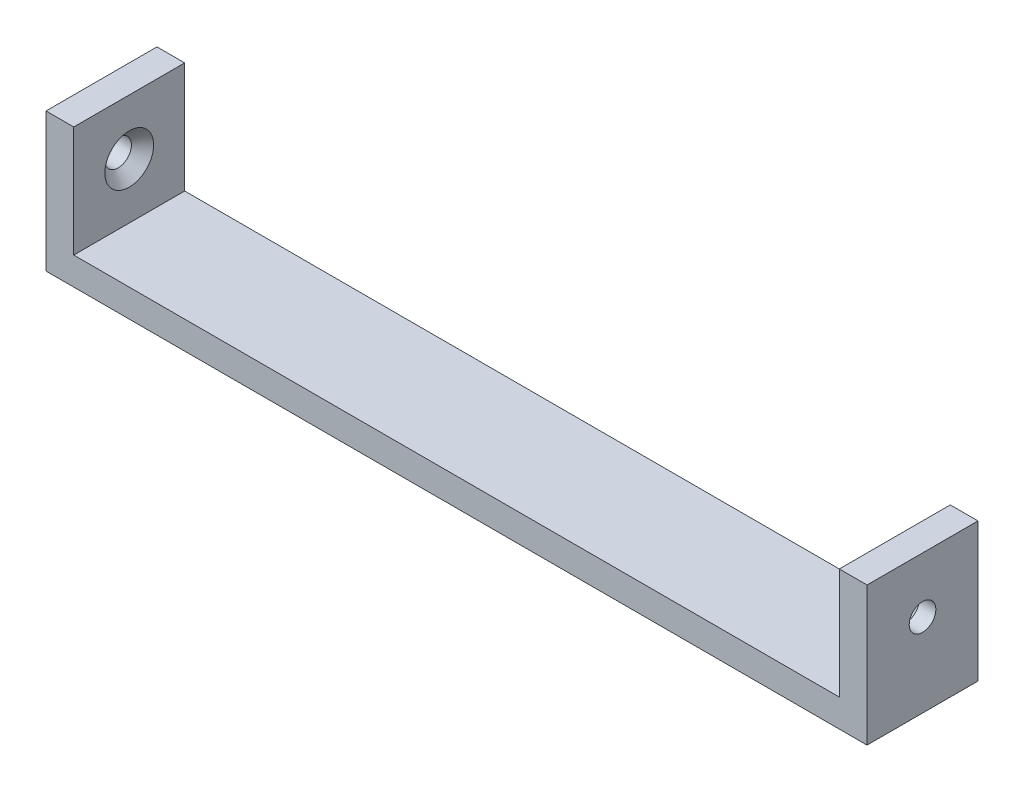
ISO-10303-21;
HEADER;
FILE_DESCRIPTION(('STEP AP214'),'2;1');
FILE_NAME('part.step','',(''),(''),'','','');
FILE_SCHEMA(('AUTOMOTIVE_DESIGN { 1 0 10303 214 1 1 1 1 }'));
ENDSEC;
DATA;
#1=APPLICATION_CONTEXT('core data for automotive mechanical design processes');
#2=APPLICATION_PROTOCOL_DEFINITION('international standard','automotive_design',2000,#1);
#3=PRODUCT_CONTEXT('',#1,'mechanical');
#4=PRODUCT('Part','Part','',(#3));
#5=PRODUCT_RELATED_PRODUCT_CATEGORY('part','',(#4));
#6=PRODUCT_DEFINITION_FORMATION('','',#4);
#7=PRODUCT_DEFINITION_CONTEXT('part definition',#1,'design');
#8=PRODUCT_DEFINITION('design','',#6,#7);
#9=PRODUCT_DEFINITION_SHAPE('','',#8);
#10=(LENGTH_UNIT() NAMED_UNIT(*) SI_UNIT(.MILLI.,.METRE.));
#11=(NAMED_UNIT(*) PLANE_ANGLE_UNIT() SI_UNIT($,.RADIAN.));
#12=(NAMED_UNIT(*) SI_UNIT($,.STERADIAN.) SOLID_ANGLE_UNIT());
#13=UNCERTAINTY_MEASURE_WITH_UNIT(LENGTH_MEASURE(1.E-05),#10,'distance_accuracy_value','');
#14=(GEOMETRIC_REPRESENTATION_CONTEXT(3) GLOBAL_UNCERTAINTY_ASSIGNED_CONTEXT((#13)) GLOBAL_UNIT_ASSIGNED_CONTEXT((#10,
#11,#12)) REPRESENTATION_CONTEXT('',''));
#15=CARTESIAN_POINT('',(0.,0.,0.));
#16=DIRECTION('',(0.,0.,1.));
#17=DIRECTION('',(1.,0.,0.));
#18=AXIS2_PLACEMENT_3D('',#15,#16,#17);
#19=CARTESIAN_POINT('',(0.,2.5,0.));
#20=DIRECTION('',(0.,1.,0.));
#21=DIRECTION('',(0.,0.,1.));
#22=AXIS2_PLACEMENT_3D('',#19,#20,#21);
#23=PLANE('',#22);
#24=DIRECTION('',(1.,0.,0.));
#25=VECTOR('',#24,1.);
#26=CARTESIAN_POINT('',(-11.6417360762424,2.5,4.3080112618134));
#27=LINE('',#26,#25);
#28=CARTESIAN_POINT('',(-9.14173607624238,2.5,4.3080112618134));
#29=VERTEX_POINT('',#28);
#30=CARTESIAN_POINT('',(59.8582639237576,2.5,4.3080112618134));
#31=VERTEX_POINT('',#30);
#32=EDGE_CURVE('E53',#29,#31,#27,.T.);
#33=ORIENTED_EDGE('',*,*,#32,.T.);
#34=DIRECTION('',(0.,0.,1.));
#35=VECTOR('',#34,1.);
#36=CARTESIAN_POINT('',(59.8582639237576,2.5,-5.6919887381866));
#37=LINE('',#36,#35);
#38=CARTESIAN_POINT('',(59.8582639237576,2.5,-5.6919887381866));
#39=VERTEX_POINT('',#38);
#40=EDGE_CURVE('E48',#39,#31,#37,.T.);
#41=ORIENTED_EDGE('',*,*,#40,.F.);
#42=DIRECTION('',(1.,0.,0.));
#43=VECTOR('',#42,1.);
#44=CARTESIAN_POINT('',(-11.6417360762424,2.5,-5.6919887381866));
#45=LINE('',#44,#43);
#46=CARTESIAN_POINT('',(-9.14173607624238,2.5,-5.6919887381866));
#47=VERTEX_POINT('',#46);
#48=EDGE_CURVE('E154',#47,#39,#45,.T.);
#49=ORIENTED_EDGE('',*,*,#48,.F.);
#50=DIRECTION('',(0.,0.,-1.));
#51=VECTOR('',#50,1.);
#52=CARTESIAN_POINT('',(-9.14173607624238,2.5,-5.6919887381866));
#53=LINE('',#52,#51);
#54=EDGE_CURVE('E133',#29,#47,#53,.T.);
#55=ORIENTED_EDGE('',*,*,#54,.F.);
#56=EDGE_LOOP('',(#33,#41,#49,#55));
#57=FACE_BOUND('',#56,.T.);
#58=ADVANCED_FACE('F33',(#57),#23,.T.);
#59=CARTESIAN_POINT('',(-11.6417360762424,2.5,-5.6919887381866));
#60=DIRECTION('',(1.,0.,0.));
#61=DIRECTION('',(0.,0.,-1.));
#62=AXIS2_PLACEMENT_3D('',#59,#60,#61);
#63=PLANE('',#62);
#64=CARTESIAN_POINT('',(-11.6417360762424,7.5,-0.6919887381866));
#65=DIRECTION('',(1.,0.,0.));
#66=DIRECTION('',(0.,0.,-1.));
#67=AXIS2_PLACEMENT_3D('',#64,#65,#66);
#68=CIRCLE('',#67,1.19999999999999);
#69=CARTESIAN_POINT('',(-11.6417360762424,7.5,-1.89198873818659));
#70=VERTEX_POINT('',#69);
#71=EDGE_CURVE('E301',#70,#70,#68,.T.);
#72=ORIENTED_EDGE('',*,*,#71,.T.);
#73=EDGE_LOOP('',(#72));
#74=FACE_BOUND('',#73,.T.);
#75=DIRECTION('',(0.,0.,1.));
#76=VECTOR('',#75,1.);
#77=CARTESIAN_POINT('',(-11.6417360762424,0.,-5.6919887381866));
#78=LINE('',#77,#76);
#79=CARTESIAN_POINT('',(-11.6417360762424,0.,-5.6919887381866));
#80=VERTEX_POINT('',#79);
#81=CARTESIAN_POINT('',(-11.6417360762424,0.,4.3080112618134));
#82=VERTEX_POINT('',#81);
#83=EDGE_CURVE('E152',#80,#82,#78,.T.);
#84=ORIENTED_EDGE('',*,*,#83,.T.);
#85=DIRECTION('',(0.,-1.,0.));
#86=VECTOR('',#85,1.);
#87=CARTESIAN_POINT('',(-11.6417360762424,2.5,4.3080112618134));
#88=LINE('',#87,#86);
#89=CARTESIAN_POINT('',(-11.6417360762424,12.5,4.3080112618134));
#90=VERTEX_POINT('',#89);
#91=EDGE_CURVE('E11',#90,#82,#88,.T.);
#92=ORIENTED_EDGE('',*,*,#91,.F.);
#93=DIRECTION('',(0.,0.,1.));
#94=VECTOR('',#93,1.);
#95=CARTESIAN_POINT('',(-11.6417360762424,12.5,-5.6919887381866));
#96=LINE('',#95,#94);
#97=CARTESIAN_POINT('',(-11.6417360762424,12.5,-5.6919887381866));
#98=VERTEX_POINT('',#97);
#99=EDGE_CURVE('E134',#98,#90,#96,.T.);
#100=ORIENTED_EDGE('',*,*,#99,.F.);
#101=DIRECTION('',(0.,-1.,0.));
#102=VECTOR('',#101,1.);
#103=CARTESIAN_POINT('',(-11.6417360762424,2.5,-5.6919887381866));
#104=LINE('',#103,#102);
#105=EDGE_CURVE('E106',#98,#80,#104,.T.);
#106=ORIENTED_EDGE('',*,*,#105,.T.);
#107=EDGE_LOOP('',(#84,#92,#100,#106));
#108=FACE_BOUND('',#107,.T.);
#109=ADVANCED_FACE('F35',(#74,#108),#63,.F.);
#110=CARTESIAN_POINT('',(-11.6417360762424,2.5,4.3080112618134));
#111=DIRECTION('',(0.,0.,-1.));
#112=DIRECTION('',(-1.,0.,0.));
#113=AXIS2_PLACEMENT_3D('',#110,#111,#112);
#114=PLANE('',#113);
#115=DIRECTION('',(1.,0.,0.));
#116=VECTOR('',#115,1.);
#117=CARTESIAN_POINT('',(-11.6417360762424,0.,4.3080112618134));
#118=LINE('',#117,#116);
#119=CARTESIAN_POINT('',(62.3582639237576,0.,4.3080112618134));
#120=VERTEX_POINT('',#119);
#121=EDGE_CURVE('E159',#82,#120,#118,.T.);
#122=ORIENTED_EDGE('',*,*,#121,.T.);
#123=DIRECTION('',(0.,-1.,0.));
#124=VECTOR('',#123,1.);
#125=CARTESIAN_POINT('',(62.3582639237576,2.5,4.3080112618134));
#126=LINE('',#125,#124);
#127=CARTESIAN_POINT('',(62.3582639237576,12.5,4.3080112618134));
#128=VERTEX_POINT('',#127);
#129=EDGE_CURVE('E41',#128,#120,#126,.T.);
#130=ORIENTED_EDGE('',*,*,#129,.F.);
#131=DIRECTION('',(1.,0.,0.));
#132=VECTOR('',#131,1.);
#133=CARTESIAN_POINT('',(59.8582639237576,12.5,4.3080112618134));
#134=LINE('',#133,#132);
#135=CARTESIAN_POINT('',(59.8582639237576,12.5,4.3080112618134));
#136=VERTEX_POINT('',#135);
#137=EDGE_CURVE('E120',#136,#128,#134,.T.);
#138=ORIENTED_EDGE('',*,*,#137,.F.);
#139=DIRECTION('',(0.,-1.,0.));
#140=VECTOR('',#139,1.);
#141=CARTESIAN_POINT('',(59.8582639237576,12.5,4.3080112618134));
#142=LINE('',#141,#140);
#143=EDGE_CURVE('E128',#136,#31,#142,.T.);
#144=ORIENTED_EDGE('',*,*,#143,.T.);
#145=ORIENTED_EDGE('',*,*,#32,.F.);
#146=DIRECTION('',(0.,-1.,0.));
#147=VECTOR('',#146,1.);
#148=CARTESIAN_POINT('',(-9.14173607624238,12.5,4.3080112618134));
#149=LINE('',#148,#147);
#150=CARTESIAN_POINT('',(-9.14173607624238,12.5,4.3080112618134));
#151=VERTEX_POINT('',#150);
#152=EDGE_CURVE('E149',#151,#29,#149,.T.);
#153=ORIENTED_EDGE('',*,*,#152,.F.);
#154=DIRECTION('',(1.,0.,0.));
#155=VECTOR('',#154,1.);
#156=CARTESIAN_POINT('',(-11.6417360762424,12.5,4.3080112618134));
#157=LINE('',#156,#155);
#158=EDGE_CURVE('E137',#90,#151,#157,.T.);
#159=ORIENTED_EDGE('',*,*,#158,.F.);
#160=ORIENTED_EDGE('',*,*,#91,.T.);
#161=EDGE_LOOP('',(#122,#130,#138,#144,#145,#153,#159,#160));
#162=FACE_BOUND('',#161,.T.);
#163=ADVANCED_FACE('F165',(#162),#114,.F.);
#164=CARTESIAN_POINT('',(62.3582639237576,2.5,-5.6919887381866));
#165=DIRECTION('',(1.,0.,0.));
#166=DIRECTION('',(0.,0.,-1.));
#167=AXIS2_PLACEMENT_3D('',#164,#165,#166);
#168=PLANE('',#167);
#169=CARTESIAN_POINT('',(62.3582639237576,7.5,-0.6919887381866));
#170=DIRECTION('',(-1.,0.,0.));
#171=DIRECTION('',(0.,0.,1.));
#172=AXIS2_PLACEMENT_3D('',#169,#170,#171);
#173=CIRCLE('',#172,1.19999999999999);
#174=CARTESIAN_POINT('',(62.3582639237576,7.5,0.508011261813389));
#175=VERTEX_POINT('',#174);
#176=EDGE_CURVE('E122',#175,#175,#173,.T.);
#177=ORIENTED_EDGE('',*,*,#176,.T.);
#178=EDGE_LOOP('',(#177));
#179=FACE_BOUND('',#178,.T.);
#180=DIRECTION('',(0.,0.,1.));
#181=VECTOR('',#180,1.);
#182=CARTESIAN_POINT('',(62.3582639237576,0.,-5.6919887381866));
#183=LINE('',#182,#181);
#184=CARTESIAN_POINT('',(62.3582639237576,0.,-5.6919887381866));
#185=VERTEX_POINT('',#184);
#186=EDGE_CURVE('E102',#185,#120,#183,.T.);
#187=ORIENTED_EDGE('',*,*,#186,.F.);
#188=DIRECTION('',(0.,-1.,0.));
#189=VECTOR('',#188,1.);
#190=CARTESIAN_POINT('',(62.3582639237576,2.5,-5.6919887381866));
#191=LINE('',#190,#189);
#192=CARTESIAN_POINT('',(62.3582639237576,12.5,-5.6919887381866));
#193=VERTEX_POINT('',#192);
#194=EDGE_CURVE('E96',#193,#185,#191,.T.);
#195=ORIENTED_EDGE('',*,*,#194,.F.);
#196=DIRECTION('',(0.,0.,-1.));
#197=VECTOR('',#196,1.);
#198=CARTESIAN_POINT('',(62.3582639237576,12.5,-5.6919887381866));
#199=LINE('',#198,#197);
#200=EDGE_CURVE('E100',#128,#193,#199,.T.);
#201=ORIENTED_EDGE('',*,*,#200,.F.);
#202=ORIENTED_EDGE('',*,*,#129,.T.);
#203=EDGE_LOOP('',(#187,#195,#201,#202));
#204=FACE_BOUND('',#203,.T.);
#205=ADVANCED_FACE('F98',(#179,#204),#168,.T.);
#206=CARTESIAN_POINT('',(-11.6417360762424,2.5,-5.6919887381866));
#207=DIRECTION('',(0.,0.,-1.));
#208=DIRECTION('',(-1.,0.,0.));
#209=AXIS2_PLACEMENT_3D('',#206,#207,#208);
#210=PLANE('',#209);
#211=DIRECTION('',(1.,0.,0.));
#212=VECTOR('',#211,1.);
#213=CARTESIAN_POINT('',(-11.6417360762424,0.,-5.6919887381866));
#214=LINE('',#213,#212);
#215=EDGE_CURVE('E155',#80,#185,#214,.T.);
#216=ORIENTED_EDGE('',*,*,#215,.F.);
#217=ORIENTED_EDGE('',*,*,#105,.F.);
#218=DIRECTION('',(-1.,0.,0.));
#219=VECTOR('',#218,1.);
#220=CARTESIAN_POINT('',(-11.6417360762424,12.5,-5.6919887381866));
#221=LINE('',#220,#219);
#222=CARTESIAN_POINT('',(-9.14173607624238,12.5,-5.6919887381866));
#223=VERTEX_POINT('',#222);
#224=EDGE_CURVE('E141',#223,#98,#221,.T.);
#225=ORIENTED_EDGE('',*,*,#224,.F.);
#226=DIRECTION('',(0.,-1.,0.));
#227=VECTOR('',#226,1.);
#228=CARTESIAN_POINT('',(-9.14173607624238,12.5,-5.6919887381866));
#229=LINE('',#228,#227);
#230=EDGE_CURVE('E144',#223,#47,#229,.T.);
#231=ORIENTED_EDGE('',*,*,#230,.T.);
#232=ORIENTED_EDGE('',*,*,#48,.T.);
#233=DIRECTION('',(0.,-1.,0.));
#234=VECTOR('',#233,1.);
#235=CARTESIAN_POINT('',(59.8582639237576,12.5,-5.6919887381866));
#236=LINE('',#235,#234);
#237=CARTESIAN_POINT('',(59.8582639237576,12.5,-5.6919887381866));
#238=VERTEX_POINT('',#237);
#239=EDGE_CURVE('E112',#238,#39,#236,.T.);
#240=ORIENTED_EDGE('',*,*,#239,.F.);
#241=DIRECTION('',(-1.,0.,0.));
#242=VECTOR('',#241,1.);
#243=CARTESIAN_POINT('',(59.8582639237576,12.5,-5.6919887381866));
#244=LINE('',#243,#242);
#245=EDGE_CURVE('E109',#193,#238,#244,.T.);
#246=ORIENTED_EDGE('',*,*,#245,.F.);
#247=ORIENTED_EDGE('',*,*,#194,.T.);
#248=EDGE_LOOP('',(#216,#217,#225,#231,#232,#240,#246,#247));
#249=FACE_BOUND('',#248,.T.);
#250=ADVANCED_FACE('F110',(#249),#210,.T.);
#251=CARTESIAN_POINT('',(0.,0.,0.));
#252=DIRECTION('',(0.,1.,0.));
#253=DIRECTION('',(0.,0.,1.));
#254=AXIS2_PLACEMENT_3D('',#251,#252,#253);
#255=PLANE('',#254);
#256=ORIENTED_EDGE('',*,*,#83,.F.);
#257=ORIENTED_EDGE('',*,*,#215,.T.);
#258=ORIENTED_EDGE('',*,*,#186,.T.);
#259=ORIENTED_EDGE('',*,*,#121,.F.);
#260=EDGE_LOOP('',(#256,#257,#258,#259));
#261=FACE_BOUND('',#260,.T.);
#262=ADVANCED_FACE('F169',(#261),#255,.F.);
#263=CARTESIAN_POINT('',(-9.14173607624238,12.5,-5.6919887381866));
#264=DIRECTION('',(-1.,0.,0.));
#265=DIRECTION('',(0.,0.,1.));
#266=AXIS2_PLACEMENT_3D('',#263,#264,#265);
#267=PLANE('',#266);
#268=CARTESIAN_POINT('',(-9.14173607624238,7.5,-0.6919887381866));
#269=DIRECTION('',(1.,0.,0.));
#270=DIRECTION('',(0.,0.,-1.));
#271=AXIS2_PLACEMENT_3D('',#268,#269,#270);
#272=CIRCLE('',#271,2.2);
#273=CARTESIAN_POINT('',(-9.14173607624238,7.5,-2.8919887381866));
#274=VERTEX_POINT('',#273);
#275=EDGE_CURVE('E299',#274,#274,#272,.T.);
#276=ORIENTED_EDGE('',*,*,#275,.F.);
#277=EDGE_LOOP('',(#276));
#278=FACE_BOUND('',#277,.T.);
#279=ORIENTED_EDGE('',*,*,#54,.T.);
#280=ORIENTED_EDGE('',*,*,#230,.F.);
#281=DIRECTION('',(0.,0.,-1.));
#282=VECTOR('',#281,1.);
#283=CARTESIAN_POINT('',(-9.14173607624238,12.5,-5.6919887381866));
#284=LINE('',#283,#282);
#285=EDGE_CURVE('E139',#151,#223,#284,.T.);
#286=ORIENTED_EDGE('',*,*,#285,.F.);
#287=ORIENTED_EDGE('',*,*,#152,.T.);
#288=EDGE_LOOP('',(#279,#280,#286,#287));
#289=FACE_BOUND('',#288,.T.);
#290=ADVANCED_FACE('F179',(#278,#289),#267,.F.);
#291=CARTESIAN_POINT('',(0.,12.5,0.));
#292=DIRECTION('',(0.,1.,0.));
#293=DIRECTION('',(0.,0.,1.));
#294=AXIS2_PLACEMENT_3D('',#291,#292,#293);
#295=PLANE('',#294);
#296=ORIENTED_EDGE('',*,*,#99,.T.);
#297=ORIENTED_EDGE('',*,*,#158,.T.);
#298=ORIENTED_EDGE('',*,*,#285,.T.);
#299=ORIENTED_EDGE('',*,*,#224,.T.);
#300=EDGE_LOOP('',(#296,#297,#298,#299));
#301=FACE_BOUND('',#300,.T.);
#302=ADVANCED_FACE('F174',(#301),#295,.T.);
#303=CARTESIAN_POINT('',(59.8582639237576,12.5,-5.6919887381866));
#304=DIRECTION('',(1.,0.,0.));
#305=DIRECTION('',(0.,0.,-1.));
#306=AXIS2_PLACEMENT_3D('',#303,#304,#305);
#307=PLANE('',#306);
#308=CARTESIAN_POINT('',(59.8582639237576,7.5,-0.6919887381866));
#309=DIRECTION('',(-1.,0.,0.));
#310=DIRECTION('',(0.,0.,1.));
#311=AXIS2_PLACEMENT_3D('',#308,#309,#310);
#312=CIRCLE('',#311,2.2);
#313=CARTESIAN_POINT('',(59.8582639237576,7.5,1.5080112618134));
#314=VERTEX_POINT('',#313);
#315=EDGE_CURVE('E306',#314,#314,#312,.T.);
#316=ORIENTED_EDGE('',*,*,#315,.F.);
#317=EDGE_LOOP('',(#316));
#318=FACE_BOUND('',#317,.T.);
#319=ORIENTED_EDGE('',*,*,#40,.T.);
#320=ORIENTED_EDGE('',*,*,#143,.F.);
#321=DIRECTION('',(0.,0.,1.));
#322=VECTOR('',#321,1.);
#323=CARTESIAN_POINT('',(59.8582639237576,12.5,-5.6919887381866));
#324=LINE('',#323,#322);
#325=EDGE_CURVE('E115',#238,#136,#324,.T.);
#326=ORIENTED_EDGE('',*,*,#325,.F.);
#327=ORIENTED_EDGE('',*,*,#239,.T.);
#328=EDGE_LOOP('',(#319,#320,#326,#327));
#329=FACE_BOUND('',#328,.T.);
#330=ADVANCED_FACE('F181',(#318,#329),#307,.F.);
#331=CARTESIAN_POINT('',(0.,12.5,0.));
#332=DIRECTION('',(0.,1.,0.));
#333=DIRECTION('',(0.,0.,1.));
#334=AXIS2_PLACEMENT_3D('',#331,#332,#333);
#335=PLANE('',#334);
#336=ORIENTED_EDGE('',*,*,#200,.T.);
#337=ORIENTED_EDGE('',*,*,#245,.T.);
#338=ORIENTED_EDGE('',*,*,#325,.T.);
#339=ORIENTED_EDGE('',*,*,#137,.T.);
#340=EDGE_LOOP('',(#336,#337,#338,#339));
#341=FACE_BOUND('',#340,.T.);
#342=ADVANCED_FACE('F118',(#341),#335,.T.);
#343=CARTESIAN_POINT('',(59.8582639237576,7.5,-0.6919887381866));
#344=DIRECTION('',(-1.,0.,0.));
#345=DIRECTION('',(0.,0.,1.));
#346=AXIS2_PLACEMENT_3D('',#343,#344,#345);
#347=CYLINDRICAL_SURFACE('',#346,1.19999999999999);
#348=ORIENTED_EDGE('',*,*,#176,.F.);
#349=EDGE_LOOP('',(#348));
#350=FACE_BOUND('',#349,.T.);
#351=CARTESIAN_POINT('',(60.8582639237576,7.5,-0.6919887381866));
#352=DIRECTION('',(-1.,0.,0.));
#353=DIRECTION('',(0.,0.,1.));
#354=AXIS2_PLACEMENT_3D('',#351,#352,#353);
#355=CIRCLE('',#354,1.19999999999999);
#356=CARTESIAN_POINT('',(60.8582639237576,7.5,0.508011261813389));
#357=VERTEX_POINT('',#356);
#358=EDGE_CURVE('E308',#357,#357,#355,.T.);
#359=ORIENTED_EDGE('',*,*,#358,.T.);
#360=EDGE_LOOP('',(#359));
#361=FACE_BOUND('',#360,.T.);
#362=ADVANCED_FACE('F191',(#350,#361),#347,.F.);
#363=CARTESIAN_POINT('',(59.8582639237576,7.5,-0.6919887381866));
#364=DIRECTION('',(-1.,0.,0.));
#365=DIRECTION('',(0.,0.,1.));
#366=AXIS2_PLACEMENT_3D('',#363,#364,#365);
#367=CONICAL_SURFACE('',#366,2.2,0.785398163397453);
#368=ORIENTED_EDGE('',*,*,#358,.F.);
#369=EDGE_LOOP('',(#368));
#370=FACE_BOUND('',#369,.T.);
#371=ORIENTED_EDGE('',*,*,#315,.T.);
#372=EDGE_LOOP('',(#371));
#373=FACE_BOUND('',#372,.T.);
#374=ADVANCED_FACE('F257',(#370,#373),#367,.F.);
#375=CARTESIAN_POINT('',(-9.14173607624238,7.5,-0.6919887381866));
#376=DIRECTION('',(1.,0.,0.));
#377=DIRECTION('',(0.,0.,-1.));
#378=AXIS2_PLACEMENT_3D('',#375,#376,#377);
#379=CYLINDRICAL_SURFACE('',#378,1.19999999999999);
#380=ORIENTED_EDGE('',*,*,#71,.F.);
#381=EDGE_LOOP('',(#380));
#382=FACE_BOUND('',#381,.T.);
#383=CARTESIAN_POINT('',(-10.1417360762424,7.5,-0.6919887381866));
#384=DIRECTION('',(1.,0.,0.));
#385=DIRECTION('',(0.,0.,-1.));
#386=AXIS2_PLACEMENT_3D('',#383,#384,#385);
#387=CIRCLE('',#386,1.19999999999999);
#388=CARTESIAN_POINT('',(-10.1417360762424,7.5,-1.89198873818659));
#389=VERTEX_POINT('',#388);
#390=EDGE_CURVE('E296',#389,#389,#387,.T.);
#391=ORIENTED_EDGE('',*,*,#390,.T.);
#392=EDGE_LOOP('',(#391));
#393=FACE_BOUND('',#392,.T.);
#394=ADVANCED_FACE('F265',(#382,#393),#379,.F.);
#395=CARTESIAN_POINT('',(-9.14173607624238,7.5,-0.6919887381866));
#396=DIRECTION('',(1.,0.,0.));
#397=DIRECTION('',(0.,0.,-1.));
#398=AXIS2_PLACEMENT_3D('',#395,#396,#397);
#399=CONICAL_SURFACE('',#398,2.2,0.785398163397453);
#400=ORIENTED_EDGE('',*,*,#390,.F.);
#401=EDGE_LOOP('',(#400));
#402=FACE_BOUND('',#401,.T.);
#403=ORIENTED_EDGE('',*,*,#275,.T.);
#404=EDGE_LOOP('',(#403));
#405=FACE_BOUND('',#404,.T.);
#406=ADVANCED_FACE('F272',(#402,#405),#399,.F.);
#407=CLOSED_SHELL('',(#58,#109,#163,#205,#250,#262,#290,#302,#330,#342,#362,#374,#394,#406));
#408=MANIFOLD_SOLID_BREP('B2',#407);
#409=ADVANCED_BREP_SHAPE_REPRESENTATION('',(#18,#408),#14);
#410=SHAPE_DEFINITION_REPRESENTATION(#9,#409);
ENDSEC;
END-ISO-10303-21;
